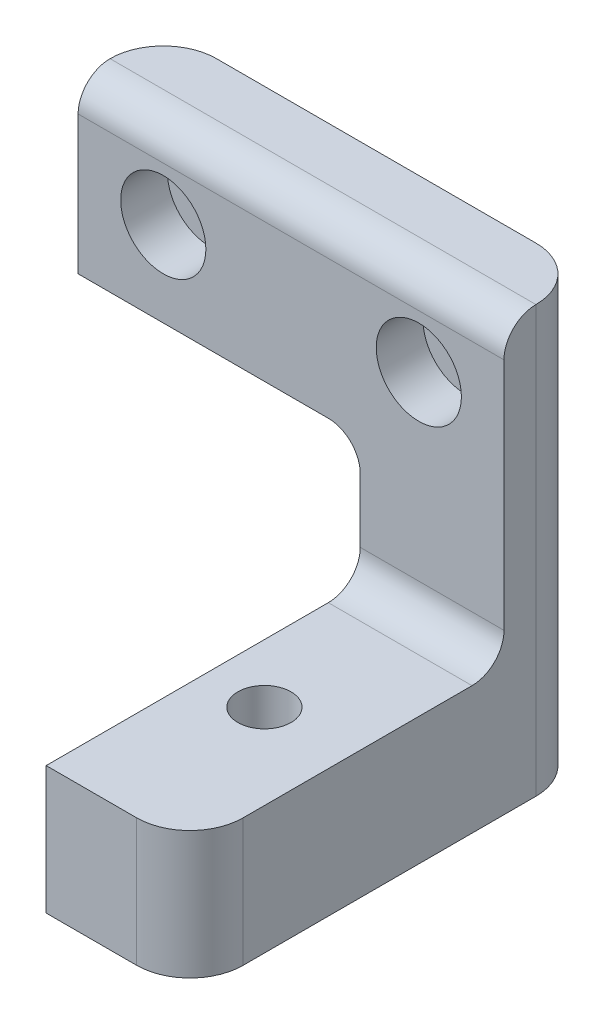
ISO-10303-21;
HEADER;
FILE_DESCRIPTION(('STEP AP214'),'2;1');
FILE_NAME('part.step','',(''),(''),'','','');
FILE_SCHEMA(('AUTOMOTIVE_DESIGN { 1 0 10303 214 1 1 1 1 }'));
ENDSEC;
DATA;
#1=APPLICATION_CONTEXT('core data for automotive mechanical design processes');
#2=APPLICATION_PROTOCOL_DEFINITION('international standard','automotive_design',2000,#1);
#3=PRODUCT_CONTEXT('',#1,'mechanical');
#4=PRODUCT('Part','Part','',(#3));
#5=PRODUCT_RELATED_PRODUCT_CATEGORY('part','',(#4));
#6=PRODUCT_DEFINITION_FORMATION('','',#4);
#7=PRODUCT_DEFINITION_CONTEXT('part definition',#1,'design');
#8=PRODUCT_DEFINITION('design','',#6,#7);
#9=PRODUCT_DEFINITION_SHAPE('','',#8);
#10=(LENGTH_UNIT() NAMED_UNIT(*) SI_UNIT(.MILLI.,.METRE.));
#11=(NAMED_UNIT(*) PLANE_ANGLE_UNIT() SI_UNIT($,.RADIAN.));
#12=(NAMED_UNIT(*) SI_UNIT($,.STERADIAN.) SOLID_ANGLE_UNIT());
#13=UNCERTAINTY_MEASURE_WITH_UNIT(LENGTH_MEASURE(1.E-05),#10,'distance_accuracy_value','');
#14=(GEOMETRIC_REPRESENTATION_CONTEXT(3) GLOBAL_UNCERTAINTY_ASSIGNED_CONTEXT((#13)) GLOBAL_UNIT_ASSIGNED_CONTEXT((#10,
#11,#12)) REPRESENTATION_CONTEXT('',''));
#15=CARTESIAN_POINT('',(0.,0.,0.));
#16=DIRECTION('',(0.,0.,1.));
#17=DIRECTION('',(1.,0.,0.));
#18=AXIS2_PLACEMENT_3D('',#15,#16,#17);
#19=CARTESIAN_POINT('',(20.,-40.,18.75));
#20=DIRECTION('',(1.,0.,0.));
#21=DIRECTION('',(0.,0.,-1.));
#22=AXIS2_PLACEMENT_3D('',#19,#20,#21);
#23=PLANE('',#22);
#24=DIRECTION('',(0.,0.,-1.));
#25=VECTOR('',#24,1.);
#26=CARTESIAN_POINT('',(20.,-40.,18.75));
#27=LINE('',#26,#25);
#28=CARTESIAN_POINT('',(20.,-40.,13.75));
#29=VERTEX_POINT('',#28);
#30=CARTESIAN_POINT('',(20.,-40.,-13.75));
#31=VERTEX_POINT('',#30);
#32=EDGE_CURVE('E179',#29,#31,#27,.T.);
#33=ORIENTED_EDGE('',*,*,#32,.T.);
#34=DIRECTION('',(0.,1.,0.));
#35=VECTOR('',#34,1.);
#36=CARTESIAN_POINT('',(20.,-40.,-13.75));
#37=LINE('',#36,#35);
#38=CARTESIAN_POINT('',(20.,0.,-13.75));
#39=VERTEX_POINT('',#38);
#40=EDGE_CURVE('E207',#31,#39,#37,.T.);
#41=ORIENTED_EDGE('',*,*,#40,.T.);
#42=CARTESIAN_POINT('',(20.,-3.,-13.75));
#43=DIRECTION('',(1.,0.,0.));
#44=DIRECTION('',(0.,0.,-1.));
#45=AXIS2_PLACEMENT_3D('',#42,#43,#44);
#46=CIRCLE('',#45,3.);
#47=CARTESIAN_POINT('',(20.,-3.,-10.75));
#48=VERTEX_POINT('',#47);
#49=EDGE_CURVE('E192',#39,#48,#46,.T.);
#50=ORIENTED_EDGE('',*,*,#49,.T.);
#51=DIRECTION('',(0.,1.,0.));
#52=VECTOR('',#51,1.);
#53=CARTESIAN_POINT('',(20.,0.,-10.75));
#54=LINE('',#53,#52);
#55=CARTESIAN_POINT('',(20.,-25.,-10.75));
#56=VERTEX_POINT('',#55);
#57=EDGE_CURVE('E167',#56,#48,#54,.T.);
#58=ORIENTED_EDGE('',*,*,#57,.F.);
#59=CARTESIAN_POINT('',(20.,-25.,-7.75));
#60=DIRECTION('',(1.,0.,0.));
#61=DIRECTION('',(0.,0.,-1.));
#62=AXIS2_PLACEMENT_3D('',#59,#60,#61);
#63=CIRCLE('',#62,3.);
#64=CARTESIAN_POINT('',(20.,-28.,-7.75));
#65=VERTEX_POINT('',#64);
#66=EDGE_CURVE('E202',#56,#65,#63,.F.);
#67=ORIENTED_EDGE('',*,*,#66,.T.);
#68=DIRECTION('',(0.,0.,-1.));
#69=VECTOR('',#68,1.);
#70=CARTESIAN_POINT('',(20.,-28.,18.75));
#71=LINE('',#70,#69);
#72=CARTESIAN_POINT('',(20.,-28.,13.75));
#73=VERTEX_POINT('',#72);
#74=EDGE_CURVE('E164',#73,#65,#71,.T.);
#75=ORIENTED_EDGE('',*,*,#74,.F.);
#76=DIRECTION('',(0.,1.,0.));
#77=VECTOR('',#76,1.);
#78=CARTESIAN_POINT('',(20.,-40.,13.75));
#79=LINE('',#78,#77);
#80=EDGE_CURVE('E204',#73,#29,#79,.F.);
#81=ORIENTED_EDGE('',*,*,#80,.T.);
#82=EDGE_LOOP('',(#33,#41,#50,#58,#67,#75,#81));
#83=FACE_BOUND('',#82,.T.);
#84=ADVANCED_FACE('F47',(#83),#23,.T.);
#85=CARTESIAN_POINT('',(-20.,-40.,18.75));
#86=DIRECTION('',(0.,0.,1.));
#87=DIRECTION('',(1.,0.,0.));
#88=AXIS2_PLACEMENT_3D('',#85,#86,#87);
#89=PLANE('',#88);
#90=DIRECTION('',(0.,1.,0.));
#91=VECTOR('',#90,1.);
#92=CARTESIAN_POINT('',(6.5,-40.001,18.75));
#93=LINE('',#92,#91);
#94=CARTESIAN_POINT('',(6.5,-40.,18.75));
#95=VERTEX_POINT('',#94);
#96=CARTESIAN_POINT('',(6.5,-28.,18.75));
#97=VERTEX_POINT('',#96);
#98=EDGE_CURVE('E253',#95,#97,#93,.T.);
#99=ORIENTED_EDGE('',*,*,#98,.F.);
#100=DIRECTION('',(1.,0.,0.));
#101=VECTOR('',#100,1.);
#102=CARTESIAN_POINT('',(-20.,-40.,18.75));
#103=LINE('',#102,#101);
#104=CARTESIAN_POINT('',(15.,-40.,18.75));
#105=VERTEX_POINT('',#104);
#106=EDGE_CURVE('E185',#95,#105,#103,.T.);
#107=ORIENTED_EDGE('',*,*,#106,.T.);
#108=DIRECTION('',(0.,1.,0.));
#109=VECTOR('',#108,1.);
#110=CARTESIAN_POINT('',(15.,-40.,18.75));
#111=LINE('',#110,#109);
#112=CARTESIAN_POINT('',(15.,-28.,18.75));
#113=VERTEX_POINT('',#112);
#114=EDGE_CURVE('E223',#105,#113,#111,.T.);
#115=ORIENTED_EDGE('',*,*,#114,.T.);
#116=DIRECTION('',(1.,0.,0.));
#117=VECTOR('',#116,1.);
#118=CARTESIAN_POINT('',(-20.001,-28.,18.75));
#119=LINE('',#118,#117);
#120=EDGE_CURVE('E176',#97,#113,#119,.T.);
#121=ORIENTED_EDGE('',*,*,#120,.F.);
#122=EDGE_LOOP('',(#99,#107,#115,#121));
#123=FACE_BOUND('',#122,.T.);
#124=ADVANCED_FACE('F283',(#123),#89,.T.);
#125=CARTESIAN_POINT('',(-20.,-40.,18.75));
#126=DIRECTION('',(-1.,0.,0.));
#127=DIRECTION('',(0.,0.,1.));
#128=AXIS2_PLACEMENT_3D('',#125,#126,#127);
#129=PLANE('',#128);
#130=DIRECTION('',(0.,0.,-1.));
#131=VECTOR('',#130,1.);
#132=CARTESIAN_POINT('',(-20.,-16.0022128562178,-18.75));
#133=LINE('',#132,#131);
#134=CARTESIAN_POINT('',(-20.,-16.0022128562178,-10.75));
#135=VERTEX_POINT('',#134);
#136=CARTESIAN_POINT('',(-20.,-16.0022128562178,-13.75));
#137=VERTEX_POINT('',#136);
#138=EDGE_CURVE('E141',#135,#137,#133,.T.);
#139=ORIENTED_EDGE('',*,*,#138,.F.);
#140=DIRECTION('',(0.,1.,0.));
#141=VECTOR('',#140,1.);
#142=CARTESIAN_POINT('',(-20.,0.,-10.75));
#143=LINE('',#142,#141);
#144=CARTESIAN_POINT('',(-20.,-3.,-10.75));
#145=VERTEX_POINT('',#144);
#146=EDGE_CURVE('E153',#135,#145,#143,.T.);
#147=ORIENTED_EDGE('',*,*,#146,.T.);
#148=CARTESIAN_POINT('',(-20.,-3.,-13.75));
#149=DIRECTION('',(-1.,0.,0.));
#150=DIRECTION('',(0.,0.,1.));
#151=AXIS2_PLACEMENT_3D('',#148,#149,#150);
#152=CIRCLE('',#151,3.);
#153=CARTESIAN_POINT('',(-20.,0.,-13.75));
#154=VERTEX_POINT('',#153);
#155=EDGE_CURVE('E197',#145,#154,#152,.T.);
#156=ORIENTED_EDGE('',*,*,#155,.T.);
#157=DIRECTION('',(0.,1.,0.));
#158=VECTOR('',#157,1.);
#159=CARTESIAN_POINT('',(-20.,-40.,-13.75));
#160=LINE('',#159,#158);
#161=EDGE_CURVE('E156',#154,#137,#160,.F.);
#162=ORIENTED_EDGE('',*,*,#161,.T.);
#163=EDGE_LOOP('',(#139,#147,#156,#162));
#164=FACE_BOUND('',#163,.T.);
#165=ADVANCED_FACE('F151',(#164),#129,.T.);
#166=CARTESIAN_POINT('',(-20.,-40.,-18.75));
#167=DIRECTION('',(0.,0.,-1.));
#168=DIRECTION('',(-1.,0.,0.));
#169=AXIS2_PLACEMENT_3D('',#166,#167,#168);
#170=PLANE('',#169);
#171=CARTESIAN_POINT('',(-12.,-8.0011064281089,-18.75));
#172=DIRECTION('',(0.,0.,1.));
#173=DIRECTION('',(1.,0.,0.));
#174=AXIS2_PLACEMENT_3D('',#171,#172,#173);
#175=CIRCLE('',#174,2.15);
#176=CARTESIAN_POINT('',(-9.85,-8.0011064281089,-18.75));
#177=VERTEX_POINT('',#176);
#178=EDGE_CURVE('E362',#177,#177,#175,.T.);
#179=ORIENTED_EDGE('',*,*,#178,.T.);
#180=EDGE_LOOP('',(#179));
#181=FACE_BOUND('',#180,.T.);
#182=CARTESIAN_POINT('',(12.,-8.0011064281089,-18.75));
#183=DIRECTION('',(0.,0.,1.));
#184=DIRECTION('',(1.,0.,0.));
#185=AXIS2_PLACEMENT_3D('',#182,#183,#184);
#186=CIRCLE('',#185,2.15);
#187=CARTESIAN_POINT('',(14.15,-8.0011064281089,-18.75));
#188=VERTEX_POINT('',#187);
#189=EDGE_CURVE('E157',#188,#188,#186,.T.);
#190=ORIENTED_EDGE('',*,*,#189,.T.);
#191=EDGE_LOOP('',(#190));
#192=FACE_BOUND('',#191,.T.);
#193=DIRECTION('',(0.,-1.,0.));
#194=VECTOR('',#193,1.);
#195=CARTESIAN_POINT('',(6.49999999999999,-40.,-18.75));
#196=LINE('',#195,#194);
#197=CARTESIAN_POINT('',(6.49999999999999,-19.0022128562178,-18.75));
#198=VERTEX_POINT('',#197);
#199=CARTESIAN_POINT('',(6.49999999999999,-40.,-18.75));
#200=VERTEX_POINT('',#199);
#201=EDGE_CURVE('E238',#198,#200,#196,.T.);
#202=ORIENTED_EDGE('',*,*,#201,.F.);
#203=CARTESIAN_POINT('',(3.49999999999999,-19.0022128562178,-18.75));
#204=DIRECTION('',(0.,0.,-1.));
#205=DIRECTION('',(-1.,0.,0.));
#206=AXIS2_PLACEMENT_3D('',#203,#204,#205);
#207=CIRCLE('',#206,3.);
#208=CARTESIAN_POINT('',(3.5,-16.0022128562178,-18.75));
#209=VERTEX_POINT('',#208);
#210=EDGE_CURVE('E55',#198,#209,#207,.F.);
#211=ORIENTED_EDGE('',*,*,#210,.T.);
#212=DIRECTION('',(-1.,0.,0.));
#213=VECTOR('',#212,1.);
#214=CARTESIAN_POINT('',(31.796121991291,-16.0022128562178,-18.75));
#215=LINE('',#214,#213);
#216=CARTESIAN_POINT('',(-15.,-16.0022128562178,-18.75));
#217=VERTEX_POINT('',#216);
#218=EDGE_CURVE('E146',#209,#217,#215,.T.);
#219=ORIENTED_EDGE('',*,*,#218,.T.);
#220=DIRECTION('',(0.,1.,0.));
#221=VECTOR('',#220,1.);
#222=CARTESIAN_POINT('',(-15.,-40.,-18.75));
#223=LINE('',#222,#221);
#224=CARTESIAN_POINT('',(-15.,0.,-18.75));
#225=VERTEX_POINT('',#224);
#226=EDGE_CURVE('E214',#217,#225,#223,.T.);
#227=ORIENTED_EDGE('',*,*,#226,.T.);
#228=DIRECTION('',(-1.,0.,0.));
#229=VECTOR('',#228,1.);
#230=CARTESIAN_POINT('',(-20.,0.,-18.75));
#231=LINE('',#230,#229);
#232=CARTESIAN_POINT('',(15.,0.,-18.75));
#233=VERTEX_POINT('',#232);
#234=EDGE_CURVE('E178',#233,#225,#231,.T.);
#235=ORIENTED_EDGE('',*,*,#234,.F.);
#236=DIRECTION('',(0.,1.,0.));
#237=VECTOR('',#236,1.);
#238=CARTESIAN_POINT('',(15.,-40.,-18.75));
#239=LINE('',#238,#237);
#240=CARTESIAN_POINT('',(15.,-40.,-18.75));
#241=VERTEX_POINT('',#240);
#242=EDGE_CURVE('E216',#233,#241,#239,.F.);
#243=ORIENTED_EDGE('',*,*,#242,.T.);
#244=DIRECTION('',(-1.,0.,0.));
#245=VECTOR('',#244,1.);
#246=CARTESIAN_POINT('',(-20.,-40.,-18.75));
#247=LINE('',#246,#245);
#248=EDGE_CURVE('E182',#241,#200,#247,.T.);
#249=ORIENTED_EDGE('',*,*,#248,.T.);
#250=EDGE_LOOP('',(#202,#211,#219,#227,#235,#243,#249));
#251=FACE_BOUND('',#250,.T.);
#252=ADVANCED_FACE('F242',(#181,#192,#251),#170,.T.);
#253=CARTESIAN_POINT('',(0.,-40.,0.));
#254=DIRECTION('',(0.,-1.,0.));
#255=DIRECTION('',(0.,0.,-1.));
#256=AXIS2_PLACEMENT_3D('',#253,#254,#255);
#257=PLANE('',#256);
#258=DIRECTION('',(0.,0.,-1.));
#259=VECTOR('',#258,1.);
#260=CARTESIAN_POINT('',(6.5,-40.,18.75));
#261=LINE('',#260,#259);
#262=EDGE_CURVE('E246',#95,#200,#261,.T.);
#263=ORIENTED_EDGE('',*,*,#262,.T.);
#264=ORIENTED_EDGE('',*,*,#248,.F.);
#265=CARTESIAN_POINT('',(15.,-40.,-13.75));
#266=DIRECTION('',(0.,-1.,0.));
#267=DIRECTION('',(0.,0.,-1.));
#268=AXIS2_PLACEMENT_3D('',#265,#266,#267);
#269=CIRCLE('',#268,5.);
#270=EDGE_CURVE('E221',#241,#31,#269,.T.);
#271=ORIENTED_EDGE('',*,*,#270,.T.);
#272=ORIENTED_EDGE('',*,*,#32,.F.);
#273=CARTESIAN_POINT('',(15.,-40.,13.75));
#274=DIRECTION('',(0.,-1.,0.));
#275=DIRECTION('',(0.,0.,-1.));
#276=AXIS2_PLACEMENT_3D('',#273,#274,#275);
#277=CIRCLE('',#276,5.);
#278=EDGE_CURVE('E218',#29,#105,#277,.T.);
#279=ORIENTED_EDGE('',*,*,#278,.T.);
#280=ORIENTED_EDGE('',*,*,#106,.F.);
#281=EDGE_LOOP('',(#263,#264,#271,#272,#279,#280));
#282=FACE_BOUND('',#281,.T.);
#283=CARTESIAN_POINT('',(12.,-40.,3.75));
#284=DIRECTION('',(0.,-1.,0.));
#285=DIRECTION('',(0.,0.,-1.));
#286=AXIS2_PLACEMENT_3D('',#283,#284,#285);
#287=CIRCLE('',#286,3.025);
#288=CARTESIAN_POINT('',(12.,-40.,0.725000000000003));
#289=VERTEX_POINT('',#288);
#290=EDGE_CURVE('E256',#289,#289,#287,.T.);
#291=ORIENTED_EDGE('',*,*,#290,.F.);
#292=EDGE_LOOP('',(#291));
#293=FACE_BOUND('',#292,.T.);
#294=ADVANCED_FACE('F330',(#282,#293),#257,.T.);
#295=CARTESIAN_POINT('',(0.,0.,0.));
#296=DIRECTION('',(0.,-1.,0.));
#297=DIRECTION('',(0.,0.,-1.));
#298=AXIS2_PLACEMENT_3D('',#295,#296,#297);
#299=PLANE('',#298);
#300=DIRECTION('',(1.,0.,0.));
#301=VECTOR('',#300,1.);
#302=CARTESIAN_POINT('',(0.,0.,-13.75));
#303=LINE('',#302,#301);
#304=EDGE_CURVE('E187',#154,#39,#303,.T.);
#305=ORIENTED_EDGE('',*,*,#304,.T.);
#306=CARTESIAN_POINT('',(15.,0.,-13.75));
#307=DIRECTION('',(0.,-1.,0.));
#308=DIRECTION('',(0.,0.,-1.));
#309=AXIS2_PLACEMENT_3D('',#306,#307,#308);
#310=CIRCLE('',#309,5.);
#311=EDGE_CURVE('E212',#39,#233,#310,.F.);
#312=ORIENTED_EDGE('',*,*,#311,.T.);
#313=ORIENTED_EDGE('',*,*,#234,.T.);
#314=CARTESIAN_POINT('',(-15.,0.,-13.75));
#315=DIRECTION('',(0.,-1.,0.));
#316=DIRECTION('',(0.,0.,-1.));
#317=AXIS2_PLACEMENT_3D('',#314,#315,#316);
#318=CIRCLE('',#317,5.);
#319=EDGE_CURVE('E210',#225,#154,#318,.F.);
#320=ORIENTED_EDGE('',*,*,#319,.T.);
#321=EDGE_LOOP('',(#305,#312,#313,#320));
#322=FACE_BOUND('',#321,.T.);
#323=ADVANCED_FACE('F323',(#322),#299,.F.);
#324=CARTESIAN_POINT('',(-20.001,0.,-10.75));
#325=DIRECTION('',(0.,0.,-1.));
#326=DIRECTION('',(0.,1.,0.));
#327=AXIS2_PLACEMENT_3D('',#324,#325,#326);
#328=PLANE('',#327);
#329=CARTESIAN_POINT('',(-12.,-8.0011064281089,-10.75));
#330=DIRECTION('',(0.,0.,1.));
#331=DIRECTION('',(1.,0.,0.));
#332=AXIS2_PLACEMENT_3D('',#329,#330,#331);
#333=CIRCLE('',#332,4.);
#334=CARTESIAN_POINT('',(-8.,-8.0011064281089,-10.75));
#335=VERTEX_POINT('',#334);
#336=EDGE_CURVE('E383',#335,#335,#333,.T.);
#337=ORIENTED_EDGE('',*,*,#336,.F.);
#338=EDGE_LOOP('',(#337));
#339=FACE_BOUND('',#338,.T.);
#340=CARTESIAN_POINT('',(12.,-8.0011064281089,-10.75));
#341=DIRECTION('',(0.,0.,1.));
#342=DIRECTION('',(1.,0.,0.));
#343=AXIS2_PLACEMENT_3D('',#340,#341,#342);
#344=CIRCLE('',#343,4.);
#345=CARTESIAN_POINT('',(16.,-8.0011064281089,-10.75));
#346=VERTEX_POINT('',#345);
#347=EDGE_CURVE('E373',#346,#346,#344,.T.);
#348=ORIENTED_EDGE('',*,*,#347,.F.);
#349=EDGE_LOOP('',(#348));
#350=FACE_BOUND('',#349,.T.);
#351=DIRECTION('',(-1.,0.,0.));
#352=VECTOR('',#351,1.);
#353=CARTESIAN_POINT('',(31.796121991291,-16.0022128562178,-10.75));
#354=LINE('',#353,#352);
#355=CARTESIAN_POINT('',(3.5,-16.0022128562178,-10.75));
#356=VERTEX_POINT('',#355);
#357=EDGE_CURVE('E137',#356,#135,#354,.T.);
#358=ORIENTED_EDGE('',*,*,#357,.F.);
#359=CARTESIAN_POINT('',(3.5,-19.0022128562178,-10.75));
#360=DIRECTION('',(0.,0.,-1.));
#361=DIRECTION('',(0.,1.,0.));
#362=AXIS2_PLACEMENT_3D('',#359,#360,#361);
#363=CIRCLE('',#362,3.);
#364=CARTESIAN_POINT('',(6.5,-19.0022128562178,-10.75));
#365=VERTEX_POINT('',#364);
#366=EDGE_CURVE('E11',#356,#365,#363,.T.);
#367=ORIENTED_EDGE('',*,*,#366,.T.);
#368=DIRECTION('',(0.,1.,0.));
#369=VECTOR('',#368,1.);
#370=CARTESIAN_POINT('',(6.5,-40.,-10.75));
#371=LINE('',#370,#369);
#372=CARTESIAN_POINT('',(6.5,-25.,-10.75));
#373=VERTEX_POINT('',#372);
#374=EDGE_CURVE('E147',#373,#365,#371,.T.);
#375=ORIENTED_EDGE('',*,*,#374,.F.);
#376=DIRECTION('',(1.,0.,0.));
#377=VECTOR('',#376,1.);
#378=CARTESIAN_POINT('',(20.,-25.,-10.75));
#379=LINE('',#378,#377);
#380=EDGE_CURVE('E194',#373,#56,#379,.T.);
#381=ORIENTED_EDGE('',*,*,#380,.T.);
#382=ORIENTED_EDGE('',*,*,#57,.T.);
#383=DIRECTION('',(1.,0.,0.));
#384=VECTOR('',#383,1.);
#385=CARTESIAN_POINT('',(-20.001,-3.,-10.75));
#386=LINE('',#385,#384);
#387=EDGE_CURVE('E162',#48,#145,#386,.F.);
#388=ORIENTED_EDGE('',*,*,#387,.T.);
#389=ORIENTED_EDGE('',*,*,#146,.F.);
#390=EDGE_LOOP('',(#358,#367,#375,#381,#382,#388,#389));
#391=FACE_BOUND('',#390,.T.);
#392=ADVANCED_FACE('F159',(#339,#350,#391),#328,.F.);
#393=CARTESIAN_POINT('',(-20.001,-28.,18.75));
#394=DIRECTION('',(0.,-1.,0.));
#395=DIRECTION('',(0.,0.,-1.));
#396=AXIS2_PLACEMENT_3D('',#393,#394,#395);
#397=PLANE('',#396);
#398=CARTESIAN_POINT('',(12.,-28.,3.75));
#399=DIRECTION('',(0.,-1.,0.));
#400=DIRECTION('',(0.,0.,-1.));
#401=AXIS2_PLACEMENT_3D('',#398,#399,#400);
#402=CIRCLE('',#401,2.5);
#403=CARTESIAN_POINT('',(12.,-28.,1.25000000000001));
#404=VERTEX_POINT('',#403);
#405=EDGE_CURVE('E165',#404,#404,#402,.T.);
#406=ORIENTED_EDGE('',*,*,#405,.T.);
#407=EDGE_LOOP('',(#406));
#408=FACE_BOUND('',#407,.T.);
#409=DIRECTION('',(1.,0.,0.));
#410=VECTOR('',#409,1.);
#411=CARTESIAN_POINT('',(-20.,-28.,-7.75));
#412=LINE('',#411,#410);
#413=CARTESIAN_POINT('',(6.5,-28.,-7.75));
#414=VERTEX_POINT('',#413);
#415=EDGE_CURVE('E199',#65,#414,#412,.F.);
#416=ORIENTED_EDGE('',*,*,#415,.T.);
#417=DIRECTION('',(0.,0.,-1.));
#418=VECTOR('',#417,1.);
#419=CARTESIAN_POINT('',(6.5,-28.,18.75));
#420=LINE('',#419,#418);
#421=EDGE_CURVE('E244',#97,#414,#420,.T.);
#422=ORIENTED_EDGE('',*,*,#421,.F.);
#423=ORIENTED_EDGE('',*,*,#120,.T.);
#424=CARTESIAN_POINT('',(15.,-28.,13.75));
#425=DIRECTION('',(0.,-1.,0.));
#426=DIRECTION('',(0.,0.,-1.));
#427=AXIS2_PLACEMENT_3D('',#424,#425,#426);
#428=CIRCLE('',#427,5.);
#429=EDGE_CURVE('E226',#113,#73,#428,.F.);
#430=ORIENTED_EDGE('',*,*,#429,.T.);
#431=ORIENTED_EDGE('',*,*,#74,.T.);
#432=EDGE_LOOP('',(#416,#422,#423,#430,#431));
#433=FACE_BOUND('',#432,.T.);
#434=ADVANCED_FACE('F298',(#408,#433),#397,.F.);
#435=CARTESIAN_POINT('',(0.,-3.,-13.75));
#436=DIRECTION('',(1.,0.,0.));
#437=DIRECTION('',(0.,0.,-1.));
#438=AXIS2_PLACEMENT_3D('',#435,#436,#437);
#439=CYLINDRICAL_SURFACE('',#438,3.);
#440=ORIENTED_EDGE('',*,*,#155,.F.);
#441=ORIENTED_EDGE('',*,*,#387,.F.);
#442=ORIENTED_EDGE('',*,*,#49,.F.);
#443=ORIENTED_EDGE('',*,*,#304,.F.);
#444=EDGE_LOOP('',(#440,#441,#442,#443));
#445=FACE_BOUND('',#444,.T.);
#446=ADVANCED_FACE('F295',(#445),#439,.T.);
#447=CARTESIAN_POINT('',(-20.001,-25.,-7.75));
#448=DIRECTION('',(-1.,0.,0.));
#449=DIRECTION('',(0.,0.,1.));
#450=AXIS2_PLACEMENT_3D('',#447,#448,#449);
#451=CYLINDRICAL_SURFACE('',#450,3.);
#452=ORIENTED_EDGE('',*,*,#380,.F.);
#453=CARTESIAN_POINT('',(6.5,-25.,-7.75));
#454=DIRECTION('',(1.,0.,0.));
#455=DIRECTION('',(0.,0.,-1.));
#456=AXIS2_PLACEMENT_3D('',#453,#454,#455);
#457=CIRCLE('',#456,3.);
#458=EDGE_CURVE('E255',#414,#373,#457,.T.);
#459=ORIENTED_EDGE('',*,*,#458,.F.);
#460=ORIENTED_EDGE('',*,*,#415,.F.);
#461=ORIENTED_EDGE('',*,*,#66,.F.);
#462=EDGE_LOOP('',(#452,#459,#460,#461));
#463=FACE_BOUND('',#462,.T.);
#464=ADVANCED_FACE('F279',(#463),#451,.F.);
#465=CARTESIAN_POINT('',(12.,-40.,3.75));
#466=DIRECTION('',(0.,-1.,0.));
#467=DIRECTION('',(0.,0.,-1.));
#468=AXIS2_PLACEMENT_3D('',#465,#466,#467);
#469=CYLINDRICAL_SURFACE('',#468,2.5);
#470=CARTESIAN_POINT('',(12.,-39.475,3.75));
#471=DIRECTION('',(0.,-1.,0.));
#472=DIRECTION('',(0.,0.,-1.));
#473=AXIS2_PLACEMENT_3D('',#470,#471,#472);
#474=CIRCLE('',#473,2.5);
#475=CARTESIAN_POINT('',(12.,-39.475,1.25));
#476=VERTEX_POINT('',#475);
#477=EDGE_CURVE('E170',#476,#476,#474,.T.);
#478=ORIENTED_EDGE('',*,*,#477,.T.);
#479=EDGE_LOOP('',(#478));
#480=FACE_BOUND('',#479,.T.);
#481=ORIENTED_EDGE('',*,*,#405,.F.);
#482=EDGE_LOOP('',(#481));
#483=FACE_BOUND('',#482,.T.);
#484=ADVANCED_FACE('F263',(#480,#483),#469,.F.);
#485=CARTESIAN_POINT('',(12.,-40.,3.75));
#486=DIRECTION('',(0.,-1.,0.));
#487=DIRECTION('',(0.,0.,-1.));
#488=AXIS2_PLACEMENT_3D('',#485,#486,#487);
#489=CONICAL_SURFACE('',#488,3.025,0.785398163397445);
#490=ORIENTED_EDGE('',*,*,#477,.F.);
#491=EDGE_LOOP('',(#490));
#492=FACE_BOUND('',#491,.T.);
#493=ORIENTED_EDGE('',*,*,#290,.T.);
#494=EDGE_LOOP('',(#493));
#495=FACE_BOUND('',#494,.T.);
#496=ADVANCED_FACE('F266',(#492,#495),#489,.F.);
#497=CARTESIAN_POINT('',(15.,-40.,-13.75));
#498=DIRECTION('',(0.,1.,0.));
#499=DIRECTION('',(0.,0.,1.));
#500=AXIS2_PLACEMENT_3D('',#497,#498,#499);
#501=CYLINDRICAL_SURFACE('',#500,5.);
#502=ORIENTED_EDGE('',*,*,#270,.F.);
#503=ORIENTED_EDGE('',*,*,#242,.F.);
#504=ORIENTED_EDGE('',*,*,#311,.F.);
#505=ORIENTED_EDGE('',*,*,#40,.F.);
#506=EDGE_LOOP('',(#502,#503,#504,#505));
#507=FACE_BOUND('',#506,.T.);
#508=ADVANCED_FACE('F268',(#507),#501,.T.);
#509=CARTESIAN_POINT('',(15.,-40.,13.75));
#510=DIRECTION('',(0.,1.,0.));
#511=DIRECTION('',(0.,0.,1.));
#512=AXIS2_PLACEMENT_3D('',#509,#510,#511);
#513=CYLINDRICAL_SURFACE('',#512,5.);
#514=ORIENTED_EDGE('',*,*,#278,.F.);
#515=ORIENTED_EDGE('',*,*,#80,.F.);
#516=ORIENTED_EDGE('',*,*,#429,.F.);
#517=ORIENTED_EDGE('',*,*,#114,.F.);
#518=EDGE_LOOP('',(#514,#515,#516,#517));
#519=FACE_BOUND('',#518,.T.);
#520=ADVANCED_FACE('F275',(#519),#513,.T.);
#521=CARTESIAN_POINT('',(-15.,-40.,-13.75));
#522=DIRECTION('',(0.,1.,0.));
#523=DIRECTION('',(0.,0.,1.));
#524=AXIS2_PLACEMENT_3D('',#521,#522,#523);
#525=CYLINDRICAL_SURFACE('',#524,5.);
#526=CARTESIAN_POINT('',(-15.,-16.0022128562178,-13.75));
#527=DIRECTION('',(0.,1.,0.));
#528=DIRECTION('',(0.,0.,1.));
#529=AXIS2_PLACEMENT_3D('',#526,#527,#528);
#530=CIRCLE('',#529,5.);
#531=EDGE_CURVE('E229',#137,#217,#530,.F.);
#532=ORIENTED_EDGE('',*,*,#531,.F.);
#533=ORIENTED_EDGE('',*,*,#161,.F.);
#534=ORIENTED_EDGE('',*,*,#319,.F.);
#535=ORIENTED_EDGE('',*,*,#226,.F.);
#536=EDGE_LOOP('',(#532,#533,#534,#535));
#537=FACE_BOUND('',#536,.T.);
#538=ADVANCED_FACE('F304',(#537),#525,.T.);
#539=CARTESIAN_POINT('',(6.5,-40.001,18.75));
#540=DIRECTION('',(1.,0.,0.));
#541=DIRECTION('',(0.,0.,-1.));
#542=AXIS2_PLACEMENT_3D('',#539,#540,#541);
#543=PLANE('',#542);
#544=ORIENTED_EDGE('',*,*,#374,.T.);
#545=DIRECTION('',(0.,0.,-1.));
#546=VECTOR('',#545,1.);
#547=CARTESIAN_POINT('',(6.49999999999999,-19.0022128562178,-18.75));
#548=LINE('',#547,#546);
#549=EDGE_CURVE('E231',#365,#198,#548,.T.);
#550=ORIENTED_EDGE('',*,*,#549,.T.);
#551=ORIENTED_EDGE('',*,*,#201,.T.);
#552=ORIENTED_EDGE('',*,*,#262,.F.);
#553=ORIENTED_EDGE('',*,*,#98,.T.);
#554=ORIENTED_EDGE('',*,*,#421,.T.);
#555=ORIENTED_EDGE('',*,*,#458,.T.);
#556=EDGE_LOOP('',(#544,#550,#551,#552,#553,#554,#555));
#557=FACE_BOUND('',#556,.T.);
#558=ADVANCED_FACE('F237',(#557),#543,.F.);
#559=CARTESIAN_POINT('',(31.796121991291,-16.0022128562178,-18.75));
#560=DIRECTION('',(0.,1.,0.));
#561=DIRECTION('',(0.,0.,1.));
#562=AXIS2_PLACEMENT_3D('',#559,#560,#561);
#563=PLANE('',#562);
#564=ORIENTED_EDGE('',*,*,#218,.F.);
#565=DIRECTION('',(0.,0.,-1.));
#566=VECTOR('',#565,1.);
#567=CARTESIAN_POINT('',(3.5,-16.0022128562178,-10.75));
#568=LINE('',#567,#566);
#569=EDGE_CURVE('E62',#209,#356,#568,.F.);
#570=ORIENTED_EDGE('',*,*,#569,.T.);
#571=ORIENTED_EDGE('',*,*,#357,.T.);
#572=ORIENTED_EDGE('',*,*,#138,.T.);
#573=ORIENTED_EDGE('',*,*,#531,.T.);
#574=EDGE_LOOP('',(#564,#570,#571,#572,#573));
#575=FACE_BOUND('',#574,.T.);
#576=ADVANCED_FACE('F139',(#575),#563,.F.);
#577=CARTESIAN_POINT('',(3.5,-19.0022128562178,18.75));
#578=DIRECTION('',(0.,0.,1.));
#579=DIRECTION('',(1.,0.,0.));
#580=AXIS2_PLACEMENT_3D('',#577,#578,#579);
#581=CYLINDRICAL_SURFACE('',#580,3.);
#582=ORIENTED_EDGE('',*,*,#366,.F.);
#583=ORIENTED_EDGE('',*,*,#569,.F.);
#584=ORIENTED_EDGE('',*,*,#210,.F.);
#585=ORIENTED_EDGE('',*,*,#549,.F.);
#586=EDGE_LOOP('',(#582,#583,#584,#585));
#587=FACE_BOUND('',#586,.T.);
#588=ADVANCED_FACE('F49',(#587),#581,.F.);
#589=CARTESIAN_POINT('',(12.,-8.0011064281089,-10.75));
#590=DIRECTION('',(0.,0.,1.));
#591=DIRECTION('',(1.,0.,0.));
#592=AXIS2_PLACEMENT_3D('',#589,#590,#591);
#593=CYLINDRICAL_SURFACE('',#592,2.15);
#594=ORIENTED_EDGE('',*,*,#189,.F.);
#595=EDGE_LOOP('',(#594));
#596=FACE_BOUND('',#595,.T.);
#597=CARTESIAN_POINT('',(12.,-8.0011064281089,-15.15));
#598=DIRECTION('',(0.,0.,1.));
#599=DIRECTION('',(1.,0.,0.));
#600=AXIS2_PLACEMENT_3D('',#597,#598,#599);
#601=CIRCLE('',#600,2.15);
#602=CARTESIAN_POINT('',(14.15,-8.0011064281089,-15.15));
#603=VERTEX_POINT('',#602);
#604=EDGE_CURVE('E366',#603,#603,#601,.T.);
#605=ORIENTED_EDGE('',*,*,#604,.T.);
#606=EDGE_LOOP('',(#605));
#607=FACE_BOUND('',#606,.T.);
#608=ADVANCED_FACE('F404',(#596,#607),#593,.F.);
#609=CARTESIAN_POINT('',(14.15,-8.0011064281089,-15.15));
#610=DIRECTION('',(0.,0.,-1.));
#611=DIRECTION('',(-1.,0.,0.));
#612=AXIS2_PLACEMENT_3D('',#609,#610,#611);
#613=PLANE('',#612);
#614=ORIENTED_EDGE('',*,*,#604,.F.);
#615=EDGE_LOOP('',(#614));
#616=FACE_BOUND('',#615,.T.);
#617=CARTESIAN_POINT('',(12.,-8.0011064281089,-15.15));
#618=DIRECTION('',(0.,0.,1.));
#619=DIRECTION('',(1.,0.,0.));
#620=AXIS2_PLACEMENT_3D('',#617,#618,#619);
#621=CIRCLE('',#620,4.);
#622=CARTESIAN_POINT('',(16.,-8.0011064281089,-15.15));
#623=VERTEX_POINT('',#622);
#624=EDGE_CURVE('E368',#623,#623,#621,.T.);
#625=ORIENTED_EDGE('',*,*,#624,.T.);
#626=EDGE_LOOP('',(#625));
#627=FACE_BOUND('',#626,.T.);
#628=ADVANCED_FACE('F394',(#616,#627),#613,.F.);
#629=CARTESIAN_POINT('',(12.,-8.0011064281089,-10.75));
#630=DIRECTION('',(0.,0.,1.));
#631=DIRECTION('',(1.,0.,0.));
#632=AXIS2_PLACEMENT_3D('',#629,#630,#631);
#633=CYLINDRICAL_SURFACE('',#632,4.);
#634=ORIENTED_EDGE('',*,*,#624,.F.);
#635=EDGE_LOOP('',(#634));
#636=FACE_BOUND('',#635,.T.);
#637=ORIENTED_EDGE('',*,*,#347,.T.);
#638=EDGE_LOOP('',(#637));
#639=FACE_BOUND('',#638,.T.);
#640=ADVANCED_FACE('F391',(#636,#639),#633,.F.);
#641=CARTESIAN_POINT('',(-12.,-8.0011064281089,-10.75));
#642=DIRECTION('',(0.,0.,1.));
#643=DIRECTION('',(1.,0.,0.));
#644=AXIS2_PLACEMENT_3D('',#641,#642,#643);
#645=CYLINDRICAL_SURFACE('',#644,2.15);
#646=ORIENTED_EDGE('',*,*,#178,.F.);
#647=EDGE_LOOP('',(#646));
#648=FACE_BOUND('',#647,.T.);
#649=CARTESIAN_POINT('',(-12.,-8.0011064281089,-15.15));
#650=DIRECTION('',(0.,0.,1.));
#651=DIRECTION('',(1.,0.,0.));
#652=AXIS2_PLACEMENT_3D('',#649,#650,#651);
#653=CIRCLE('',#652,2.15);
#654=CARTESIAN_POINT('',(-9.85,-8.0011064281089,-15.15));
#655=VERTEX_POINT('',#654);
#656=EDGE_CURVE('E377',#655,#655,#653,.T.);
#657=ORIENTED_EDGE('',*,*,#656,.T.);
#658=EDGE_LOOP('',(#657));
#659=FACE_BOUND('',#658,.T.);
#660=ADVANCED_FACE('F393',(#648,#659),#645,.F.);
#661=CARTESIAN_POINT('',(-9.85,-8.0011064281089,-15.15));
#662=DIRECTION('',(0.,0.,-1.));
#663=DIRECTION('',(-1.,0.,0.));
#664=AXIS2_PLACEMENT_3D('',#661,#662,#663);
#665=PLANE('',#664);
#666=ORIENTED_EDGE('',*,*,#656,.F.);
#667=EDGE_LOOP('',(#666));
#668=FACE_BOUND('',#667,.T.);
#669=CARTESIAN_POINT('',(-12.,-8.0011064281089,-15.15));
#670=DIRECTION('',(0.,0.,1.));
#671=DIRECTION('',(1.,0.,0.));
#672=AXIS2_PLACEMENT_3D('',#669,#670,#671);
#673=CIRCLE('',#672,4.);
#674=CARTESIAN_POINT('',(-8.,-8.0011064281089,-15.15));
#675=VERTEX_POINT('',#674);
#676=EDGE_CURVE('E380',#675,#675,#673,.T.);
#677=ORIENTED_EDGE('',*,*,#676,.T.);
#678=EDGE_LOOP('',(#677));
#679=FACE_BOUND('',#678,.T.);
#680=ADVANCED_FACE('F401',(#668,#679),#665,.F.);
#681=CARTESIAN_POINT('',(-12.,-8.0011064281089,-10.75));
#682=DIRECTION('',(0.,0.,1.));
#683=DIRECTION('',(1.,0.,0.));
#684=AXIS2_PLACEMENT_3D('',#681,#682,#683);
#685=CYLINDRICAL_SURFACE('',#684,4.);
#686=ORIENTED_EDGE('',*,*,#676,.F.);
#687=EDGE_LOOP('',(#686));
#688=FACE_BOUND('',#687,.T.);
#689=ORIENTED_EDGE('',*,*,#336,.T.);
#690=EDGE_LOOP('',(#689));
#691=FACE_BOUND('',#690,.T.);
#692=ADVANCED_FACE('F387',(#688,#691),#685,.F.);
#693=CLOSED_SHELL('',(#84,#124,#165,#252,#294,#323,#392,#434,#446,#464,#484,#496,#508,#520,#538,
#558,#576,#588,#608,#628,#640,#660,#680,#692));
#694=MANIFOLD_SOLID_BREP('B2',#693);
#695=ADVANCED_BREP_SHAPE_REPRESENTATION('',(#18,#694),#14);
#696=SHAPE_DEFINITION_REPRESENTATION(#9,#695);
ENDSEC;
END-ISO-10303-21;
